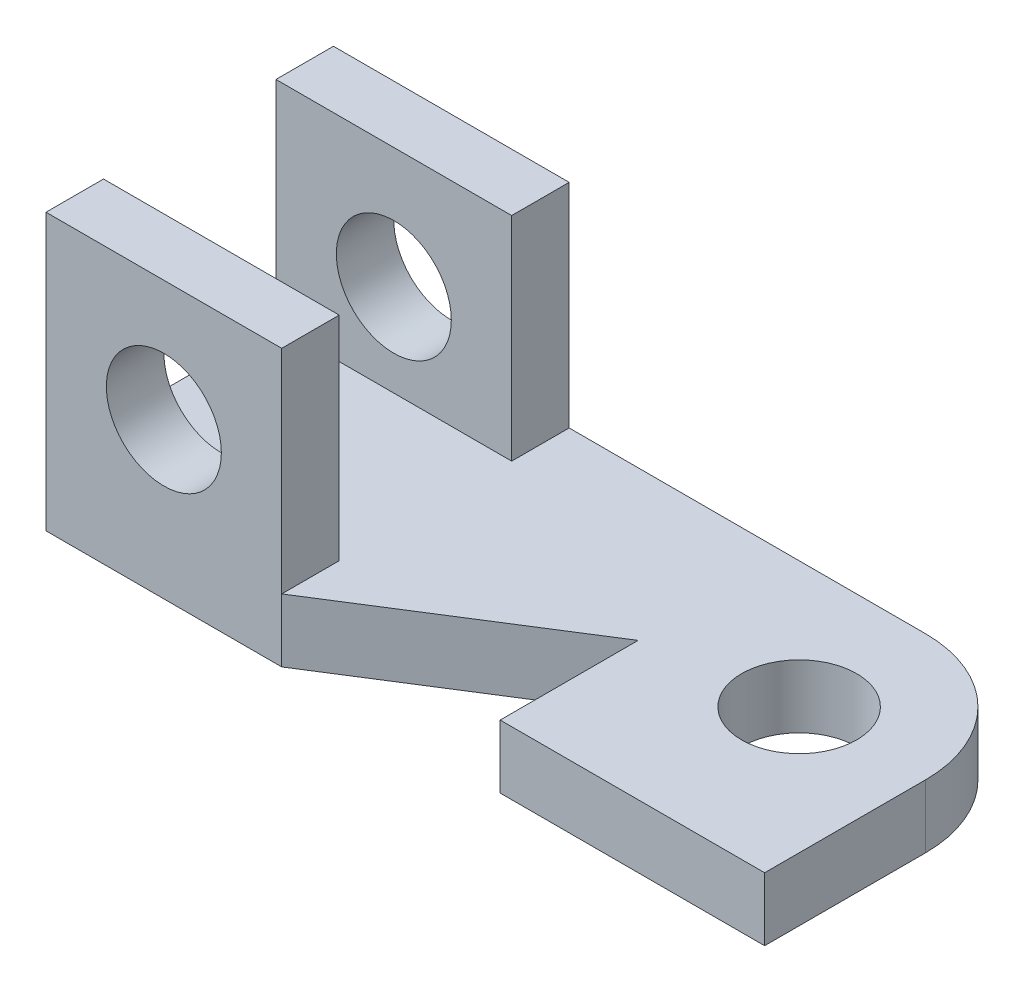
ISO-10303-21;
HEADER;
FILE_DESCRIPTION(('STEP AP214'),'2;1');
FILE_NAME('part.step','',(''),(''),'','','');
FILE_SCHEMA(('AUTOMOTIVE_DESIGN { 1 0 10303 214 1 1 1 1 }'));
ENDSEC;
DATA;
#1=APPLICATION_CONTEXT('core data for automotive mechanical design processes');
#2=APPLICATION_PROTOCOL_DEFINITION('international standard','automotive_design',2000,#1);
#3=PRODUCT_CONTEXT('',#1,'mechanical');
#4=PRODUCT('Part','Part','',(#3));
#5=PRODUCT_RELATED_PRODUCT_CATEGORY('part','',(#4));
#6=PRODUCT_DEFINITION_FORMATION('','',#4);
#7=PRODUCT_DEFINITION_CONTEXT('part definition',#1,'design');
#8=PRODUCT_DEFINITION('design','',#6,#7);
#9=PRODUCT_DEFINITION_SHAPE('','',#8);
#10=(LENGTH_UNIT() NAMED_UNIT(*) SI_UNIT(.MILLI.,.METRE.));
#11=(NAMED_UNIT(*) PLANE_ANGLE_UNIT() SI_UNIT($,.RADIAN.));
#12=(NAMED_UNIT(*) SI_UNIT($,.STERADIAN.) SOLID_ANGLE_UNIT());
#13=UNCERTAINTY_MEASURE_WITH_UNIT(LENGTH_MEASURE(1.E-05),#10,'distance_accuracy_value','');
#14=(GEOMETRIC_REPRESENTATION_CONTEXT(3) GLOBAL_UNCERTAINTY_ASSIGNED_CONTEXT((#13)) GLOBAL_UNIT_ASSIGNED_CONTEXT((#10,
#11,#12)) REPRESENTATION_CONTEXT('',''));
#15=CARTESIAN_POINT('',(0.,0.,0.));
#16=DIRECTION('',(0.,0.,1.));
#17=DIRECTION('',(1.,0.,0.));
#18=AXIS2_PLACEMENT_3D('',#15,#16,#17);
#19=CARTESIAN_POINT('',(2616.2,279.4,-711.200000000001));
#20=DIRECTION('',(0.,-1.,0.));
#21=DIRECTION('',(0.,0.,-1.));
#22=AXIS2_PLACEMENT_3D('',#19,#20,#21);
#23=PLANE('',#22);
#24=CARTESIAN_POINT('',(2616.2,279.4,-711.200000000001));
#25=DIRECTION('',(0.,1.,0.));
#26=DIRECTION('',(0.,0.,1.));
#27=AXIS2_PLACEMENT_3D('',#24,#25,#26);
#28=CIRCLE('',#27,254.);
#29=CARTESIAN_POINT('',(2616.2,279.4,-457.200000000001));
#30=VERTEX_POINT('',#29);
#31=EDGE_CURVE('E176',#30,#30,#28,.T.);
#32=ORIENTED_EDGE('',*,*,#31,.F.);
#33=EDGE_LOOP('',(#32));
#34=FACE_BOUND('',#33,.T.);
#35=DIRECTION('',(0.,0.,-1.));
#36=VECTOR('',#35,1.);
#37=CARTESIAN_POINT('',(1041.4,279.4,-1270.));
#38=LINE('',#37,#36);
#39=CARTESIAN_POINT('',(1041.4,279.4,-1016.));
#40=VERTEX_POINT('',#39);
#41=CARTESIAN_POINT('',(1041.4,279.4,-1270.));
#42=VERTEX_POINT('',#41);
#43=EDGE_CURVE('E166',#40,#42,#38,.T.);
#44=ORIENTED_EDGE('',*,*,#43,.F.);
#45=DIRECTION('',(1.,0.,0.));
#46=VECTOR('',#45,1.);
#47=CARTESIAN_POINT('',(0.,279.4,-1016.));
#48=LINE('',#47,#46);
#49=CARTESIAN_POINT('',(0.,279.4,-1016.));
#50=VERTEX_POINT('',#49);
#51=EDGE_CURVE('E203',#50,#40,#48,.T.);
#52=ORIENTED_EDGE('',*,*,#51,.F.);
#53=DIRECTION('',(0.,0.,1.));
#54=VECTOR('',#53,1.);
#55=CARTESIAN_POINT('',(0.,279.4,-1270.));
#56=LINE('',#55,#54);
#57=CARTESIAN_POINT('',(0.,279.4,-254.));
#58=VERTEX_POINT('',#57);
#59=EDGE_CURVE('E69',#50,#58,#56,.T.);
#60=ORIENTED_EDGE('',*,*,#59,.T.);
#61=DIRECTION('',(-1.,0.,0.));
#62=VECTOR('',#61,1.);
#63=CARTESIAN_POINT('',(0.,279.4,-254.));
#64=LINE('',#63,#62);
#65=CARTESIAN_POINT('',(1041.4,279.4,-254.));
#66=VERTEX_POINT('',#65);
#67=EDGE_CURVE('E195',#66,#58,#64,.T.);
#68=ORIENTED_EDGE('',*,*,#67,.F.);
#69=DIRECTION('',(0.,0.,-1.));
#70=VECTOR('',#69,1.);
#71=CARTESIAN_POINT('',(1041.4,279.4,-254.));
#72=LINE('',#71,#70);
#73=CARTESIAN_POINT('',(1041.4,279.4,0.));
#74=VERTEX_POINT('',#73);
#75=EDGE_CURVE('E198',#74,#66,#72,.T.);
#76=ORIENTED_EDGE('',*,*,#75,.F.);
#77=DIRECTION('',(0.845488903030971,0.,-0.533992991387982));
#78=VECTOR('',#77,1.);
#79=CARTESIAN_POINT('',(1041.4,279.4,0.));
#80=LINE('',#79,#78);
#81=CARTESIAN_POINT('',(2006.6,279.4,-609.6));
#82=VERTEX_POINT('',#81);
#83=EDGE_CURVE('E221',#74,#82,#80,.T.);
#84=ORIENTED_EDGE('',*,*,#83,.T.);
#85=DIRECTION('',(0.,0.,1.));
#86=VECTOR('',#85,1.);
#87=CARTESIAN_POINT('',(2006.6,279.4,-609.6));
#88=LINE('',#87,#86);
#89=CARTESIAN_POINT('',(2006.6,279.4,0.));
#90=VERTEX_POINT('',#89);
#91=EDGE_CURVE('E225',#82,#90,#88,.T.);
#92=ORIENTED_EDGE('',*,*,#91,.T.);
#93=DIRECTION('',(1.,0.,0.));
#94=VECTOR('',#93,1.);
#95=CARTESIAN_POINT('',(2006.6,279.4,0.));
#96=LINE('',#95,#94);
#97=CARTESIAN_POINT('',(3175.,279.4,0.));
#98=VERTEX_POINT('',#97);
#99=EDGE_CURVE('E228',#90,#98,#96,.T.);
#100=ORIENTED_EDGE('',*,*,#99,.T.);
#101=DIRECTION('',(0.,0.,-1.));
#102=VECTOR('',#101,1.);
#103=CARTESIAN_POINT('',(3175.,279.4,0.));
#104=LINE('',#103,#102);
#105=CARTESIAN_POINT('',(3175.,279.4,-711.200000000001));
#106=VERTEX_POINT('',#105);
#107=EDGE_CURVE('E231',#98,#106,#104,.T.);
#108=ORIENTED_EDGE('',*,*,#107,.T.);
#109=CARTESIAN_POINT('',(2616.2,279.4,-711.200000000001));
#110=DIRECTION('',(0.,1.,0.));
#111=DIRECTION('',(0.,0.,-1.));
#112=AXIS2_PLACEMENT_3D('',#109,#110,#111);
#113=CIRCLE('',#112,558.8);
#114=CARTESIAN_POINT('',(2616.2,279.4,-1270.));
#115=VERTEX_POINT('',#114);
#116=EDGE_CURVE('E234',#106,#115,#113,.T.);
#117=ORIENTED_EDGE('',*,*,#116,.T.);
#118=DIRECTION('',(-1.,0.,0.));
#119=VECTOR('',#118,1.);
#120=CARTESIAN_POINT('',(2616.2,279.4,-1270.));
#121=LINE('',#120,#119);
#122=EDGE_CURVE('E62',#115,#42,#121,.T.);
#123=ORIENTED_EDGE('',*,*,#122,.T.);
#124=EDGE_LOOP('',(#44,#52,#60,#68,#76,#84,#92,#100,#108,#117,#123));
#125=FACE_BOUND('',#124,.T.);
#126=ADVANCED_FACE('F45',(#34,#125),#23,.F.);
#127=CARTESIAN_POINT('',(2616.2,0.,-711.200000000001));
#128=DIRECTION('',(0.,-1.,0.));
#129=DIRECTION('',(0.,0.,-1.));
#130=AXIS2_PLACEMENT_3D('',#127,#128,#129);
#131=PLANE('',#130);
#132=DIRECTION('',(0.,0.,1.));
#133=VECTOR('',#132,1.);
#134=CARTESIAN_POINT('',(0.,0.,-1270.));
#135=LINE('',#134,#133);
#136=CARTESIAN_POINT('',(0.,0.,-1270.));
#137=VERTEX_POINT('',#136);
#138=CARTESIAN_POINT('',(0.,0.,0.));
#139=VERTEX_POINT('',#138);
#140=EDGE_CURVE('E217',#137,#139,#135,.T.);
#141=ORIENTED_EDGE('',*,*,#140,.F.);
#142=DIRECTION('',(-1.,0.,0.));
#143=VECTOR('',#142,1.);
#144=CARTESIAN_POINT('',(2616.2,0.,-1270.));
#145=LINE('',#144,#143);
#146=CARTESIAN_POINT('',(2616.2,0.,-1270.));
#147=VERTEX_POINT('',#146);
#148=EDGE_CURVE('E222',#147,#137,#145,.T.);
#149=ORIENTED_EDGE('',*,*,#148,.F.);
#150=CARTESIAN_POINT('',(2616.2,0.,-711.200000000001));
#151=DIRECTION('',(0.,1.,0.));
#152=DIRECTION('',(0.,0.,-1.));
#153=AXIS2_PLACEMENT_3D('',#150,#151,#152);
#154=CIRCLE('',#153,558.8);
#155=CARTESIAN_POINT('',(3175.,0.,-711.200000000001));
#156=VERTEX_POINT('',#155);
#157=EDGE_CURVE('E257',#156,#147,#154,.T.);
#158=ORIENTED_EDGE('',*,*,#157,.F.);
#159=DIRECTION('',(0.,0.,-1.));
#160=VECTOR('',#159,1.);
#161=CARTESIAN_POINT('',(3175.,0.,0.));
#162=LINE('',#161,#160);
#163=CARTESIAN_POINT('',(3175.,0.,0.));
#164=VERTEX_POINT('',#163);
#165=EDGE_CURVE('E254',#164,#156,#162,.T.);
#166=ORIENTED_EDGE('',*,*,#165,.F.);
#167=DIRECTION('',(1.,0.,0.));
#168=VECTOR('',#167,1.);
#169=CARTESIAN_POINT('',(2006.6,0.,0.));
#170=LINE('',#169,#168);
#171=CARTESIAN_POINT('',(2006.6,0.,0.));
#172=VERTEX_POINT('',#171);
#173=EDGE_CURVE('E251',#172,#164,#170,.T.);
#174=ORIENTED_EDGE('',*,*,#173,.F.);
#175=DIRECTION('',(0.,0.,1.));
#176=VECTOR('',#175,1.);
#177=CARTESIAN_POINT('',(2006.6,0.,-609.6));
#178=LINE('',#177,#176);
#179=CARTESIAN_POINT('',(2006.6,0.,-609.6));
#180=VERTEX_POINT('',#179);
#181=EDGE_CURVE('E248',#180,#172,#178,.T.);
#182=ORIENTED_EDGE('',*,*,#181,.F.);
#183=DIRECTION('',(0.845488903030971,0.,-0.533992991387982));
#184=VECTOR('',#183,1.);
#185=CARTESIAN_POINT('',(1041.4,0.,0.));
#186=LINE('',#185,#184);
#187=CARTESIAN_POINT('',(1041.4,0.,0.));
#188=VERTEX_POINT('',#187);
#189=EDGE_CURVE('E245',#188,#180,#186,.T.);
#190=ORIENTED_EDGE('',*,*,#189,.F.);
#191=DIRECTION('',(1.,0.,0.));
#192=VECTOR('',#191,1.);
#193=CARTESIAN_POINT('',(0.,0.,0.));
#194=LINE('',#193,#192);
#195=EDGE_CURVE('E242',#139,#188,#194,.T.);
#196=ORIENTED_EDGE('',*,*,#195,.F.);
#197=EDGE_LOOP('',(#141,#149,#158,#166,#174,#182,#190,#196));
#198=FACE_BOUND('',#197,.T.);
#199=CARTESIAN_POINT('',(2616.2,0.,-711.200000000001));
#200=DIRECTION('',(0.,1.,0.));
#201=DIRECTION('',(0.,0.,1.));
#202=AXIS2_PLACEMENT_3D('',#199,#200,#201);
#203=CIRCLE('',#202,254.);
#204=CARTESIAN_POINT('',(2616.2,0.,-457.200000000001));
#205=VERTEX_POINT('',#204);
#206=EDGE_CURVE('E171',#205,#205,#203,.T.);
#207=ORIENTED_EDGE('',*,*,#206,.T.);
#208=EDGE_LOOP('',(#207));
#209=FACE_BOUND('',#208,.T.);
#210=ADVANCED_FACE('F297',(#198,#209),#131,.T.);
#211=CARTESIAN_POINT('',(0.,279.4,-1270.));
#212=DIRECTION('',(1.,0.,0.));
#213=DIRECTION('',(0.,0.,-1.));
#214=AXIS2_PLACEMENT_3D('',#211,#212,#213);
#215=PLANE('',#214);
#216=ORIENTED_EDGE('',*,*,#140,.T.);
#217=DIRECTION('',(0.,-1.,0.));
#218=VECTOR('',#217,1.);
#219=CARTESIAN_POINT('',(0.,279.4,0.));
#220=LINE('',#219,#218);
#221=CARTESIAN_POINT('',(0.,1219.2,0.));
#222=VERTEX_POINT('',#221);
#223=EDGE_CURVE('E11',#222,#139,#220,.T.);
#224=ORIENTED_EDGE('',*,*,#223,.F.);
#225=DIRECTION('',(0.,0.,1.));
#226=VECTOR('',#225,1.);
#227=CARTESIAN_POINT('',(0.,1219.2,-254.));
#228=LINE('',#227,#226);
#229=CARTESIAN_POINT('',(0.,1219.2,-254.));
#230=VERTEX_POINT('',#229);
#231=EDGE_CURVE('E199',#230,#222,#228,.T.);
#232=ORIENTED_EDGE('',*,*,#231,.F.);
#233=DIRECTION('',(0.,-1.,0.));
#234=VECTOR('',#233,1.);
#235=CARTESIAN_POINT('',(0.,1219.2,-254.));
#236=LINE('',#235,#234);
#237=EDGE_CURVE('E191',#230,#58,#236,.T.);
#238=ORIENTED_EDGE('',*,*,#237,.T.);
#239=ORIENTED_EDGE('',*,*,#59,.F.);
#240=DIRECTION('',(0.,-1.,0.));
#241=VECTOR('',#240,1.);
#242=CARTESIAN_POINT('',(0.,1219.2,-1016.));
#243=LINE('',#242,#241);
#244=CARTESIAN_POINT('',(0.,1219.2,-1016.));
#245=VERTEX_POINT('',#244);
#246=EDGE_CURVE('E149',#245,#50,#243,.T.);
#247=ORIENTED_EDGE('',*,*,#246,.F.);
#248=DIRECTION('',(0.,0.,1.));
#249=VECTOR('',#248,1.);
#250=CARTESIAN_POINT('',(0.,1219.2,-1270.));
#251=LINE('',#250,#249);
#252=CARTESIAN_POINT('',(0.,1219.2,-1270.));
#253=VERTEX_POINT('',#252);
#254=EDGE_CURVE('E156',#253,#245,#251,.T.);
#255=ORIENTED_EDGE('',*,*,#254,.F.);
#256=DIRECTION('',(0.,-1.,0.));
#257=VECTOR('',#256,1.);
#258=CARTESIAN_POINT('',(0.,279.4,-1270.));
#259=LINE('',#258,#257);
#260=EDGE_CURVE('E239',#253,#137,#259,.T.);
#261=ORIENTED_EDGE('',*,*,#260,.T.);
#262=EDGE_LOOP('',(#216,#224,#232,#238,#239,#247,#255,#261));
#263=FACE_BOUND('',#262,.T.);
#264=ADVANCED_FACE('F47',(#263),#215,.F.);
#265=CARTESIAN_POINT('',(0.,279.4,0.));
#266=DIRECTION('',(0.,0.,-1.));
#267=DIRECTION('',(-1.,0.,0.));
#268=AXIS2_PLACEMENT_3D('',#265,#266,#267);
#269=PLANE('',#268);
#270=CARTESIAN_POINT('',(520.7,685.8,0.));
#271=DIRECTION('',(0.,0.,1.));
#272=DIRECTION('',(1.,0.,0.));
#273=AXIS2_PLACEMENT_3D('',#270,#271,#272);
#274=CIRCLE('',#273,254.);
#275=CARTESIAN_POINT('',(774.7,685.8,-2.22044604925031E-13));
#276=VERTEX_POINT('',#275);
#277=EDGE_CURVE('E491',#276,#276,#274,.T.);
#278=ORIENTED_EDGE('',*,*,#277,.F.);
#279=EDGE_LOOP('',(#278));
#280=FACE_BOUND('',#279,.T.);
#281=ORIENTED_EDGE('',*,*,#195,.T.);
#282=DIRECTION('',(0.,-1.,0.));
#283=VECTOR('',#282,1.);
#284=CARTESIAN_POINT('',(1041.4,279.4,0.));
#285=LINE('',#284,#283);
#286=EDGE_CURVE('E55',#74,#188,#285,.T.);
#287=ORIENTED_EDGE('',*,*,#286,.F.);
#288=DIRECTION('',(0.,-1.,0.));
#289=VECTOR('',#288,1.);
#290=CARTESIAN_POINT('',(1041.4,1219.2,0.));
#291=LINE('',#290,#289);
#292=CARTESIAN_POINT('',(1041.4,1219.2,0.));
#293=VERTEX_POINT('',#292);
#294=EDGE_CURVE('E182',#293,#74,#291,.T.);
#295=ORIENTED_EDGE('',*,*,#294,.F.);
#296=DIRECTION('',(1.,0.,0.));
#297=VECTOR('',#296,1.);
#298=CARTESIAN_POINT('',(0.,1219.2,0.));
#299=LINE('',#298,#297);
#300=EDGE_CURVE('E209',#222,#293,#299,.T.);
#301=ORIENTED_EDGE('',*,*,#300,.F.);
#302=ORIENTED_EDGE('',*,*,#223,.T.);
#303=EDGE_LOOP('',(#281,#287,#295,#301,#302));
#304=FACE_BOUND('',#303,.T.);
#305=ADVANCED_FACE('F323',(#280,#304),#269,.F.);
#306=CARTESIAN_POINT('',(1041.4,279.4,0.));
#307=DIRECTION('',(-0.533992991387982,0.,-0.845488903030971));
#308=DIRECTION('',(-0.845488903030971,0.,0.533992991387982));
#309=AXIS2_PLACEMENT_3D('',#306,#307,#308);
#310=PLANE('',#309);
#311=ORIENTED_EDGE('',*,*,#189,.T.);
#312=DIRECTION('',(0.,-1.,0.));
#313=VECTOR('',#312,1.);
#314=CARTESIAN_POINT('',(2006.6,279.4,-609.6));
#315=LINE('',#314,#313);
#316=EDGE_CURVE('E280',#82,#180,#315,.T.);
#317=ORIENTED_EDGE('',*,*,#316,.F.);
#318=ORIENTED_EDGE('',*,*,#83,.F.);
#319=ORIENTED_EDGE('',*,*,#286,.T.);
#320=EDGE_LOOP('',(#311,#317,#318,#319));
#321=FACE_BOUND('',#320,.T.);
#322=ADVANCED_FACE('F290',(#321),#310,.F.);
#323=CARTESIAN_POINT('',(2006.6,279.4,-609.6));
#324=DIRECTION('',(1.,0.,0.));
#325=DIRECTION('',(0.,0.,-1.));
#326=AXIS2_PLACEMENT_3D('',#323,#324,#325);
#327=PLANE('',#326);
#328=ORIENTED_EDGE('',*,*,#181,.T.);
#329=DIRECTION('',(0.,-1.,0.));
#330=VECTOR('',#329,1.);
#331=CARTESIAN_POINT('',(2006.6,279.4,0.));
#332=LINE('',#331,#330);
#333=EDGE_CURVE('E276',#90,#172,#332,.T.);
#334=ORIENTED_EDGE('',*,*,#333,.F.);
#335=ORIENTED_EDGE('',*,*,#91,.F.);
#336=ORIENTED_EDGE('',*,*,#316,.T.);
#337=EDGE_LOOP('',(#328,#334,#335,#336));
#338=FACE_BOUND('',#337,.T.);
#339=ADVANCED_FACE('F303',(#338),#327,.F.);
#340=CARTESIAN_POINT('',(2006.6,279.4,0.));
#341=DIRECTION('',(0.,0.,-1.));
#342=DIRECTION('',(-1.,0.,0.));
#343=AXIS2_PLACEMENT_3D('',#340,#341,#342);
#344=PLANE('',#343);
#345=ORIENTED_EDGE('',*,*,#173,.T.);
#346=DIRECTION('',(0.,-1.,0.));
#347=VECTOR('',#346,1.);
#348=CARTESIAN_POINT('',(3175.,279.4,0.));
#349=LINE('',#348,#347);
#350=EDGE_CURVE('E272',#98,#164,#349,.T.);
#351=ORIENTED_EDGE('',*,*,#350,.F.);
#352=ORIENTED_EDGE('',*,*,#99,.F.);
#353=ORIENTED_EDGE('',*,*,#333,.T.);
#354=EDGE_LOOP('',(#345,#351,#352,#353));
#355=FACE_BOUND('',#354,.T.);
#356=ADVANCED_FACE('F307',(#355),#344,.F.);
#357=CARTESIAN_POINT('',(3175.,279.4,0.));
#358=DIRECTION('',(-1.,0.,0.));
#359=DIRECTION('',(0.,0.,1.));
#360=AXIS2_PLACEMENT_3D('',#357,#358,#359);
#361=PLANE('',#360);
#362=ORIENTED_EDGE('',*,*,#165,.T.);
#363=DIRECTION('',(0.,-1.,0.));
#364=VECTOR('',#363,1.);
#365=CARTESIAN_POINT('',(3175.,279.4,-711.200000000001));
#366=LINE('',#365,#364);
#367=EDGE_CURVE('E268',#106,#156,#366,.T.);
#368=ORIENTED_EDGE('',*,*,#367,.F.);
#369=ORIENTED_EDGE('',*,*,#107,.F.);
#370=ORIENTED_EDGE('',*,*,#350,.T.);
#371=EDGE_LOOP('',(#362,#368,#369,#370));
#372=FACE_BOUND('',#371,.T.);
#373=ADVANCED_FACE('F353',(#372),#361,.F.);
#374=CARTESIAN_POINT('',(2616.2,279.4,-711.200000000001));
#375=DIRECTION('',(0.,-1.,0.));
#376=DIRECTION('',(0.,0.,-1.));
#377=AXIS2_PLACEMENT_3D('',#374,#375,#376);
#378=CYLINDRICAL_SURFACE('',#377,558.8);
#379=ORIENTED_EDGE('',*,*,#157,.T.);
#380=DIRECTION('',(0.,-1.,0.));
#381=VECTOR('',#380,1.);
#382=CARTESIAN_POINT('',(2616.2,279.4,-1270.));
#383=LINE('',#382,#381);
#384=EDGE_CURVE('E264',#115,#147,#383,.T.);
#385=ORIENTED_EDGE('',*,*,#384,.F.);
#386=ORIENTED_EDGE('',*,*,#116,.F.);
#387=ORIENTED_EDGE('',*,*,#367,.T.);
#388=EDGE_LOOP('',(#379,#385,#386,#387));
#389=FACE_BOUND('',#388,.T.);
#390=ADVANCED_FACE('F349',(#389),#378,.T.);
#391=CARTESIAN_POINT('',(2616.2,279.4,-1270.));
#392=DIRECTION('',(0.,0.,1.));
#393=DIRECTION('',(1.,0.,0.));
#394=AXIS2_PLACEMENT_3D('',#391,#392,#393);
#395=PLANE('',#394);
#396=CARTESIAN_POINT('',(520.7,685.8,-1270.));
#397=DIRECTION('',(0.,0.,1.));
#398=DIRECTION('',(1.,0.,0.));
#399=AXIS2_PLACEMENT_3D('',#396,#397,#398);
#400=CIRCLE('',#399,254.);
#401=CARTESIAN_POINT('',(774.7,685.8,-1270.));
#402=VERTEX_POINT('',#401);
#403=EDGE_CURVE('E498',#402,#402,#400,.T.);
#404=ORIENTED_EDGE('',*,*,#403,.T.);
#405=EDGE_LOOP('',(#404));
#406=FACE_BOUND('',#405,.T.);
#407=ORIENTED_EDGE('',*,*,#148,.T.);
#408=ORIENTED_EDGE('',*,*,#260,.F.);
#409=DIRECTION('',(-1.,0.,0.));
#410=VECTOR('',#409,1.);
#411=CARTESIAN_POINT('',(0.,1219.2,-1270.));
#412=LINE('',#411,#410);
#413=CARTESIAN_POINT('',(1041.4,1219.2,-1270.));
#414=VERTEX_POINT('',#413);
#415=EDGE_CURVE('E162',#414,#253,#412,.T.);
#416=ORIENTED_EDGE('',*,*,#415,.F.);
#417=DIRECTION('',(0.,-1.,0.));
#418=VECTOR('',#417,1.);
#419=CARTESIAN_POINT('',(1041.4,1219.2,-1270.));
#420=LINE('',#419,#418);
#421=EDGE_CURVE('E178',#414,#42,#420,.T.);
#422=ORIENTED_EDGE('',*,*,#421,.T.);
#423=ORIENTED_EDGE('',*,*,#122,.F.);
#424=ORIENTED_EDGE('',*,*,#384,.T.);
#425=EDGE_LOOP('',(#407,#408,#416,#422,#423,#424));
#426=FACE_BOUND('',#425,.T.);
#427=ADVANCED_FACE('F347',(#406,#426),#395,.F.);
#428=CARTESIAN_POINT('',(2616.2,279.4,-711.200000000001));
#429=DIRECTION('',(0.,-1.,0.));
#430=DIRECTION('',(0.,0.,-1.));
#431=AXIS2_PLACEMENT_3D('',#428,#429,#430);
#432=CYLINDRICAL_SURFACE('',#431,254.);
#433=ORIENTED_EDGE('',*,*,#31,.T.);
#434=EDGE_LOOP('',(#433));
#435=FACE_BOUND('',#434,.T.);
#436=ORIENTED_EDGE('',*,*,#206,.F.);
#437=EDGE_LOOP('',(#436));
#438=FACE_BOUND('',#437,.T.);
#439=ADVANCED_FACE('F344',(#435,#438),#432,.F.);
#440=CARTESIAN_POINT('',(1041.4,1219.2,-254.));
#441=DIRECTION('',(-1.,0.,0.));
#442=DIRECTION('',(0.,0.,1.));
#443=AXIS2_PLACEMENT_3D('',#440,#441,#442);
#444=PLANE('',#443);
#445=ORIENTED_EDGE('',*,*,#75,.T.);
#446=DIRECTION('',(0.,-1.,0.));
#447=VECTOR('',#446,1.);
#448=CARTESIAN_POINT('',(1041.4,1219.2,-254.));
#449=LINE('',#448,#447);
#450=CARTESIAN_POINT('',(1041.4,1219.2,-254.));
#451=VERTEX_POINT('',#450);
#452=EDGE_CURVE('E186',#451,#66,#449,.T.);
#453=ORIENTED_EDGE('',*,*,#452,.F.);
#454=DIRECTION('',(0.,0.,-1.));
#455=VECTOR('',#454,1.);
#456=CARTESIAN_POINT('',(1041.4,1219.2,-254.));
#457=LINE('',#456,#455);
#458=EDGE_CURVE('E206',#293,#451,#457,.T.);
#459=ORIENTED_EDGE('',*,*,#458,.F.);
#460=ORIENTED_EDGE('',*,*,#294,.T.);
#461=EDGE_LOOP('',(#445,#453,#459,#460));
#462=FACE_BOUND('',#461,.T.);
#463=ADVANCED_FACE('F313',(#462),#444,.F.);
#464=CARTESIAN_POINT('',(0.,1219.2,-254.));
#465=DIRECTION('',(0.,0.,1.));
#466=DIRECTION('',(1.,0.,0.));
#467=AXIS2_PLACEMENT_3D('',#464,#465,#466);
#468=PLANE('',#467);
#469=CARTESIAN_POINT('',(520.7,685.8,-254.));
#470=DIRECTION('',(0.,0.,1.));
#471=DIRECTION('',(1.,0.,0.));
#472=AXIS2_PLACEMENT_3D('',#469,#470,#471);
#473=CIRCLE('',#472,254.);
#474=CARTESIAN_POINT('',(774.7,685.8,-254.));
#475=VERTEX_POINT('',#474);
#476=EDGE_CURVE('E187',#475,#475,#473,.T.);
#477=ORIENTED_EDGE('',*,*,#476,.T.);
#478=EDGE_LOOP('',(#477));
#479=FACE_BOUND('',#478,.T.);
#480=ORIENTED_EDGE('',*,*,#67,.T.);
#481=ORIENTED_EDGE('',*,*,#237,.F.);
#482=DIRECTION('',(-1.,0.,0.));
#483=VECTOR('',#482,1.);
#484=CARTESIAN_POINT('',(0.,1219.2,-254.));
#485=LINE('',#484,#483);
#486=EDGE_CURVE('E194',#451,#230,#485,.T.);
#487=ORIENTED_EDGE('',*,*,#486,.F.);
#488=ORIENTED_EDGE('',*,*,#452,.T.);
#489=EDGE_LOOP('',(#480,#481,#487,#488));
#490=FACE_BOUND('',#489,.T.);
#491=ADVANCED_FACE('F317',(#479,#490),#468,.F.);
#492=CARTESIAN_POINT('',(0.,1219.2,0.));
#493=DIRECTION('',(0.,1.,0.));
#494=DIRECTION('',(0.,0.,1.));
#495=AXIS2_PLACEMENT_3D('',#492,#493,#494);
#496=PLANE('',#495);
#497=ORIENTED_EDGE('',*,*,#231,.T.);
#498=ORIENTED_EDGE('',*,*,#300,.T.);
#499=ORIENTED_EDGE('',*,*,#458,.T.);
#500=ORIENTED_EDGE('',*,*,#486,.T.);
#501=EDGE_LOOP('',(#497,#498,#499,#500));
#502=FACE_BOUND('',#501,.T.);
#503=ADVANCED_FACE('F321',(#502),#496,.T.);
#504=CARTESIAN_POINT('',(0.,1219.2,-1016.));
#505=DIRECTION('',(0.,0.,-1.));
#506=DIRECTION('',(-1.,0.,0.));
#507=AXIS2_PLACEMENT_3D('',#504,#505,#506);
#508=PLANE('',#507);
#509=CARTESIAN_POINT('',(520.7,685.8,-1016.));
#510=DIRECTION('',(0.,0.,-1.));
#511=DIRECTION('',(-1.,0.,0.));
#512=AXIS2_PLACEMENT_3D('',#509,#510,#511);
#513=CIRCLE('',#512,254.);
#514=CARTESIAN_POINT('',(774.7,685.8,-1016.));
#515=VERTEX_POINT('',#514);
#516=EDGE_CURVE('E49',#515,#515,#513,.T.);
#517=ORIENTED_EDGE('',*,*,#516,.T.);
#518=EDGE_LOOP('',(#517));
#519=FACE_BOUND('',#518,.T.);
#520=ORIENTED_EDGE('',*,*,#51,.T.);
#521=DIRECTION('',(0.,-1.,0.));
#522=VECTOR('',#521,1.);
#523=CARTESIAN_POINT('',(1041.4,1219.2,-1016.));
#524=LINE('',#523,#522);
#525=CARTESIAN_POINT('',(1041.4,1219.2,-1016.));
#526=VERTEX_POINT('',#525);
#527=EDGE_CURVE('E151',#526,#40,#524,.T.);
#528=ORIENTED_EDGE('',*,*,#527,.F.);
#529=DIRECTION('',(1.,0.,0.));
#530=VECTOR('',#529,1.);
#531=CARTESIAN_POINT('',(0.,1219.2,-1016.));
#532=LINE('',#531,#530);
#533=EDGE_CURVE('E144',#245,#526,#532,.T.);
#534=ORIENTED_EDGE('',*,*,#533,.F.);
#535=ORIENTED_EDGE('',*,*,#246,.T.);
#536=EDGE_LOOP('',(#520,#528,#534,#535));
#537=FACE_BOUND('',#536,.T.);
#538=ADVANCED_FACE('F147',(#519,#537),#508,.F.);
#539=CARTESIAN_POINT('',(1041.4,1219.2,-1270.));
#540=DIRECTION('',(-1.,0.,0.));
#541=DIRECTION('',(0.,0.,1.));
#542=AXIS2_PLACEMENT_3D('',#539,#540,#541);
#543=PLANE('',#542);
#544=ORIENTED_EDGE('',*,*,#43,.T.);
#545=ORIENTED_EDGE('',*,*,#421,.F.);
#546=DIRECTION('',(0.,0.,-1.));
#547=VECTOR('',#546,1.);
#548=CARTESIAN_POINT('',(1041.4,1219.2,-1270.));
#549=LINE('',#548,#547);
#550=EDGE_CURVE('E155',#526,#414,#549,.T.);
#551=ORIENTED_EDGE('',*,*,#550,.F.);
#552=ORIENTED_EDGE('',*,*,#527,.T.);
#553=EDGE_LOOP('',(#544,#545,#551,#552));
#554=FACE_BOUND('',#553,.T.);
#555=ADVANCED_FACE('F451',(#554),#543,.F.);
#556=CARTESIAN_POINT('',(0.,1219.2,0.));
#557=DIRECTION('',(0.,1.,0.));
#558=DIRECTION('',(0.,0.,1.));
#559=AXIS2_PLACEMENT_3D('',#556,#557,#558);
#560=PLANE('',#559);
#561=ORIENTED_EDGE('',*,*,#254,.T.);
#562=ORIENTED_EDGE('',*,*,#533,.T.);
#563=ORIENTED_EDGE('',*,*,#550,.T.);
#564=ORIENTED_EDGE('',*,*,#415,.T.);
#565=EDGE_LOOP('',(#561,#562,#563,#564));
#566=FACE_BOUND('',#565,.T.);
#567=ADVANCED_FACE('F160',(#566),#560,.T.);
#568=CARTESIAN_POINT('',(520.7,685.8,-1270.));
#569=DIRECTION('',(0.,0.,1.));
#570=DIRECTION('',(1.,0.,0.));
#571=AXIS2_PLACEMENT_3D('',#568,#569,#570);
#572=CYLINDRICAL_SURFACE('',#571,254.);
#573=CARTESIAN_POINT('',(774.7,685.8,-1270.));
#574=CARTESIAN_POINT('',(774.7,685.8,-1267.35416666667));
#575=CARTESIAN_POINT('',(774.7,685.8,-1264.70833333333));
#576=CARTESIAN_POINT('',(774.7,685.8,-1259.41666666667));
#577=CARTESIAN_POINT('',(774.7,685.8,-1256.77083333333));
#578=CARTESIAN_POINT('',(774.7,685.8,-1251.47916666667));
#579=CARTESIAN_POINT('',(774.7,685.8,-1248.83333333333));
#580=CARTESIAN_POINT('',(774.7,685.8,-1243.54166666667));
#581=CARTESIAN_POINT('',(774.7,685.8,-1240.89583333333));
#582=CARTESIAN_POINT('',(774.7,685.8,-1235.60416666667));
#583=CARTESIAN_POINT('',(774.7,685.8,-1232.95833333333));
#584=CARTESIAN_POINT('',(774.7,685.8,-1227.66666666667));
#585=CARTESIAN_POINT('',(774.7,685.8,-1225.02083333333));
#586=CARTESIAN_POINT('',(774.7,685.8,-1219.72916666667));
#587=CARTESIAN_POINT('',(774.7,685.8,-1217.08333333333));
#588=CARTESIAN_POINT('',(774.7,685.8,-1211.79166666667));
#589=CARTESIAN_POINT('',(774.7,685.8,-1209.14583333333));
#590=CARTESIAN_POINT('',(774.7,685.8,-1203.85416666667));
#591=CARTESIAN_POINT('',(774.7,685.8,-1201.20833333333));
#592=CARTESIAN_POINT('',(774.7,685.8,-1195.91666666667));
#593=CARTESIAN_POINT('',(774.7,685.8,-1193.27083333333));
#594=CARTESIAN_POINT('',(774.7,685.8,-1187.97916666667));
#595=CARTESIAN_POINT('',(774.7,685.8,-1185.33333333333));
#596=CARTESIAN_POINT('',(774.7,685.8,-1180.04166666667));
#597=CARTESIAN_POINT('',(774.7,685.8,-1177.39583333333));
#598=CARTESIAN_POINT('',(774.7,685.8,-1172.10416666667));
#599=CARTESIAN_POINT('',(774.7,685.8,-1169.45833333333));
#600=CARTESIAN_POINT('',(774.7,685.8,-1164.16666666667));
#601=CARTESIAN_POINT('',(774.7,685.8,-1161.52083333333));
#602=CARTESIAN_POINT('',(774.7,685.8,-1156.22916666667));
#603=CARTESIAN_POINT('',(774.7,685.8,-1153.58333333333));
#604=CARTESIAN_POINT('',(774.7,685.8,-1148.29166666667));
#605=CARTESIAN_POINT('',(774.7,685.8,-1145.64583333333));
#606=CARTESIAN_POINT('',(774.7,685.8,-1140.35416666667));
#607=CARTESIAN_POINT('',(774.7,685.8,-1137.70833333333));
#608=CARTESIAN_POINT('',(774.7,685.8,-1132.41666666667));
#609=CARTESIAN_POINT('',(774.7,685.8,-1129.77083333333));
#610=CARTESIAN_POINT('',(774.7,685.8,-1124.47916666667));
#611=CARTESIAN_POINT('',(774.7,685.8,-1121.83333333333));
#612=CARTESIAN_POINT('',(774.7,685.8,-1116.54166666667));
#613=CARTESIAN_POINT('',(774.7,685.8,-1113.89583333333));
#614=CARTESIAN_POINT('',(774.7,685.8,-1108.60416666667));
#615=CARTESIAN_POINT('',(774.7,685.8,-1105.95833333333));
#616=CARTESIAN_POINT('',(774.7,685.8,-1100.66666666667));
#617=CARTESIAN_POINT('',(774.7,685.8,-1098.02083333333));
#618=CARTESIAN_POINT('',(774.7,685.8,-1092.72916666667));
#619=CARTESIAN_POINT('',(774.7,685.8,-1090.08333333333));
#620=CARTESIAN_POINT('',(774.7,685.8,-1084.79166666667));
#621=CARTESIAN_POINT('',(774.7,685.8,-1082.14583333333));
#622=CARTESIAN_POINT('',(774.7,685.8,-1076.85416666667));
#623=CARTESIAN_POINT('',(774.7,685.8,-1074.20833333333));
#624=CARTESIAN_POINT('',(774.7,685.8,-1068.91666666667));
#625=CARTESIAN_POINT('',(774.7,685.8,-1066.27083333333));
#626=CARTESIAN_POINT('',(774.7,685.8,-1060.97916666667));
#627=CARTESIAN_POINT('',(774.7,685.8,-1058.33333333333));
#628=CARTESIAN_POINT('',(774.7,685.8,-1053.04166666667));
#629=CARTESIAN_POINT('',(774.7,685.8,-1050.39583333333));
#630=CARTESIAN_POINT('',(774.7,685.8,-1045.10416666667));
#631=CARTESIAN_POINT('',(774.7,685.8,-1042.45833333333));
#632=CARTESIAN_POINT('',(774.7,685.8,-1037.16666666667));
#633=CARTESIAN_POINT('',(774.7,685.8,-1034.52083333333));
#634=CARTESIAN_POINT('',(774.7,685.8,-1029.22916666667));
#635=CARTESIAN_POINT('',(774.7,685.8,-1026.58333333333));
#636=CARTESIAN_POINT('',(774.7,685.8,-1021.29166666667));
#637=CARTESIAN_POINT('',(774.7,685.8,-1018.64583333333));
#638=CARTESIAN_POINT('',(774.7,685.8,-1016.));
#639=B_SPLINE_CURVE_WITH_KNOTS('',3,(#573,#574,#575,#576,#577,#578,#579,#580,#581,#582,#583,
#584,#585,#586,#587,#588,#589,#590,#591,#592,#593,#594,#595,#596,#597,#598,#599,#600,#601,#602,
#603,#604,#605,#606,#607,#608,#609,#610,#611,#612,#613,#614,#615,#616,#617,#618,#619,#620,#621,
#622,#623,#624,#625,#626,#627,#628,#629,#630,#631,#632,#633,#634,#635,#636,#637,#638),
.UNSPECIFIED.,.F.,.F.,(4,2,2,2,2,2,2,2,2,2,2,2,2,2,2,2,2,2,2,2,2,2,2,2,2,2,2,2,2,2,2,2,4),(0.,
7.93750000000015,15.8750000000001,23.8125,31.7500000000002,39.6875000000001,47.625,
55.5625000000002,63.5000000000001,71.4375,79.375,87.3125000000001,95.2500000000001,103.1875,
111.125,119.0625,127.,134.9375,142.875,150.8125,158.75,166.6875,174.625,182.5625,190.5,198.4375,
206.375,214.3125,222.25,230.1875,238.125,246.0625,254.),.UNSPECIFIED.);
#640=EDGE_CURVE('BSEAM469',#402,#515,#639,.T.);
#641=ORIENTED_EDGE('',*,*,#403,.F.);
#642=ORIENTED_EDGE('',*,*,#516,.F.);
#643=ORIENTED_EDGE('',*,*,#640,.T.);
#644=ORIENTED_EDGE('',*,*,#640,.F.);
#645=EDGE_LOOP('',(#641,#643,#642,#644));
#646=FACE_BOUND('',#645,.T.);
#647=ADVANCED_FACE('F469',(#646),#572,.F.);
#648=CARTESIAN_POINT('',(774.7,685.8,-2.22044604925031E-13));
#649=CARTESIAN_POINT('',(774.7,685.8,-2.64583333333353));
#650=CARTESIAN_POINT('',(774.7,685.8,-5.29166666666684));
#651=CARTESIAN_POINT('',(774.7,685.8,-10.5833333333335));
#652=CARTESIAN_POINT('',(774.7,685.8,-13.2291666666669));
#653=CARTESIAN_POINT('',(774.7,685.8,-18.5208333333336));
#654=CARTESIAN_POINT('',(774.7,685.8,-21.1666666666669));
#655=CARTESIAN_POINT('',(774.7,685.8,-26.4583333333335));
#656=CARTESIAN_POINT('',(774.7,685.8,-29.1041666666669));
#657=CARTESIAN_POINT('',(774.7,685.8,-34.3958333333335));
#658=CARTESIAN_POINT('',(774.7,685.8,-37.0416666666669));
#659=CARTESIAN_POINT('',(774.7,685.8,-42.3333333333336));
#660=CARTESIAN_POINT('',(774.7,685.8,-44.9791666666669));
#661=CARTESIAN_POINT('',(774.7,685.8,-50.2708333333336));
#662=CARTESIAN_POINT('',(774.7,685.8,-52.9166666666669));
#663=CARTESIAN_POINT('',(774.7,685.8,-58.2083333333335));
#664=CARTESIAN_POINT('',(774.7,685.8,-60.8541666666668));
#665=CARTESIAN_POINT('',(774.7,685.8,-66.1458333333335));
#666=CARTESIAN_POINT('',(774.7,685.8,-68.7916666666669));
#667=CARTESIAN_POINT('',(774.7,685.8,-74.0833333333336));
#668=CARTESIAN_POINT('',(774.7,685.8,-76.7291666666669));
#669=CARTESIAN_POINT('',(774.7,685.8,-82.0208333333335));
#670=CARTESIAN_POINT('',(774.7,685.8,-84.6666666666668));
#671=CARTESIAN_POINT('',(774.7,685.8,-89.9583333333335));
#672=CARTESIAN_POINT('',(774.7,685.8,-92.6041666666669));
#673=CARTESIAN_POINT('',(774.7,685.8,-97.8958333333336));
#674=CARTESIAN_POINT('',(774.7,685.8,-100.541666666667));
#675=CARTESIAN_POINT('',(774.7,685.8,-105.833333333334));
#676=CARTESIAN_POINT('',(774.7,685.8,-108.479166666667));
#677=CARTESIAN_POINT('',(774.7,685.8,-113.770833333334));
#678=CARTESIAN_POINT('',(774.7,685.8,-116.416666666667));
#679=CARTESIAN_POINT('',(774.7,685.8,-121.708333333334));
#680=CARTESIAN_POINT('',(774.7,685.8,-124.354166666667));
#681=CARTESIAN_POINT('',(774.7,685.8,-129.645833333334));
#682=CARTESIAN_POINT('',(774.7,685.8,-132.291666666667));
#683=CARTESIAN_POINT('',(774.7,685.8,-137.583333333334));
#684=CARTESIAN_POINT('',(774.7,685.8,-140.229166666667));
#685=CARTESIAN_POINT('',(774.7,685.8,-145.520833333334));
#686=CARTESIAN_POINT('',(774.7,685.8,-148.166666666667));
#687=CARTESIAN_POINT('',(774.7,685.8,-153.458333333334));
#688=CARTESIAN_POINT('',(774.7,685.8,-156.104166666667));
#689=CARTESIAN_POINT('',(774.7,685.8,-161.395833333334));
#690=CARTESIAN_POINT('',(774.7,685.8,-164.041666666667));
#691=CARTESIAN_POINT('',(774.7,685.8,-169.333333333334));
#692=CARTESIAN_POINT('',(774.7,685.8,-171.979166666667));
#693=CARTESIAN_POINT('',(774.7,685.8,-177.270833333334));
#694=CARTESIAN_POINT('',(774.7,685.8,-179.916666666667));
#695=CARTESIAN_POINT('',(774.7,685.8,-185.208333333334));
#696=CARTESIAN_POINT('',(774.7,685.8,-187.854166666667));
#697=CARTESIAN_POINT('',(774.7,685.8,-193.145833333334));
#698=CARTESIAN_POINT('',(774.7,685.8,-195.791666666667));
#699=CARTESIAN_POINT('',(774.7,685.8,-201.083333333334));
#700=CARTESIAN_POINT('',(774.7,685.8,-203.729166666667));
#701=CARTESIAN_POINT('',(774.7,685.8,-209.020833333334));
#702=CARTESIAN_POINT('',(774.7,685.8,-211.666666666667));
#703=CARTESIAN_POINT('',(774.7,685.8,-216.958333333334));
#704=CARTESIAN_POINT('',(774.7,685.8,-219.604166666667));
#705=CARTESIAN_POINT('',(774.7,685.8,-224.895833333334));
#706=CARTESIAN_POINT('',(774.7,685.8,-227.541666666667));
#707=CARTESIAN_POINT('',(774.7,685.8,-232.833333333334));
#708=CARTESIAN_POINT('',(774.7,685.8,-235.479166666667));
#709=CARTESIAN_POINT('',(774.7,685.8,-240.770833333334));
#710=CARTESIAN_POINT('',(774.7,685.8,-243.416666666667));
#711=CARTESIAN_POINT('',(774.7,685.8,-248.708333333334));
#712=CARTESIAN_POINT('',(774.7,685.8,-251.354166666667));
#713=CARTESIAN_POINT('',(774.7,685.8,-254.));
#714=B_SPLINE_CURVE_WITH_KNOTS('',3,(#648,#649,#650,#651,#652,#653,#654,#655,#656,#657,#658,
#659,#660,#661,#662,#663,#664,#665,#666,#667,#668,#669,#670,#671,#672,#673,#674,#675,#676,#677,
#678,#679,#680,#681,#682,#683,#684,#685,#686,#687,#688,#689,#690,#691,#692,#693,#694,#695,#696,
#697,#698,#699,#700,#701,#702,#703,#704,#705,#706,#707,#708,#709,#710,#711,#712,#713),
.UNSPECIFIED.,.F.,.F.,(4,2,2,2,2,2,2,2,2,2,2,2,2,2,2,2,2,2,2,2,2,2,2,2,2,2,2,2,2,2,2,2,4),(0.,
7.93749999999993,15.8750000000001,23.8125,31.7499999999999,39.6875000000001,47.625,55.5625,
63.4999999999999,71.4375,79.375,87.3124999999999,95.2500000000001,103.1875,111.125,119.0625,
127.,134.9375,142.875,150.8125,158.75,166.6875,174.625,182.5625,190.5,198.4375,206.375,214.3125,
222.25,230.1875,238.125,246.0625,254.),.UNSPECIFIED.);
#715=EDGE_CURVE('BSEAM477',#276,#475,#714,.T.);
#716=ORIENTED_EDGE('',*,*,#277,.T.);
#717=ORIENTED_EDGE('',*,*,#476,.F.);
#718=ORIENTED_EDGE('',*,*,#715,.T.);
#719=ORIENTED_EDGE('',*,*,#715,.F.);
#720=EDGE_LOOP('',(#716,#718,#717,#719));
#721=FACE_BOUND('',#720,.T.);
#722=ADVANCED_FACE('F477',(#721),#572,.F.);
#723=CLOSED_SHELL('',(#126,#210,#264,#305,#322,#339,#356,#373,#390,#427,#439,#463,#491,#503,
#538,#555,#567,#647,#722));
#724=MANIFOLD_SOLID_BREP('B2',#723);
#725=ADVANCED_BREP_SHAPE_REPRESENTATION('',(#18,#724),#14);
#726=SHAPE_DEFINITION_REPRESENTATION(#9,#725);
ENDSEC;
END-ISO-10303-21;
